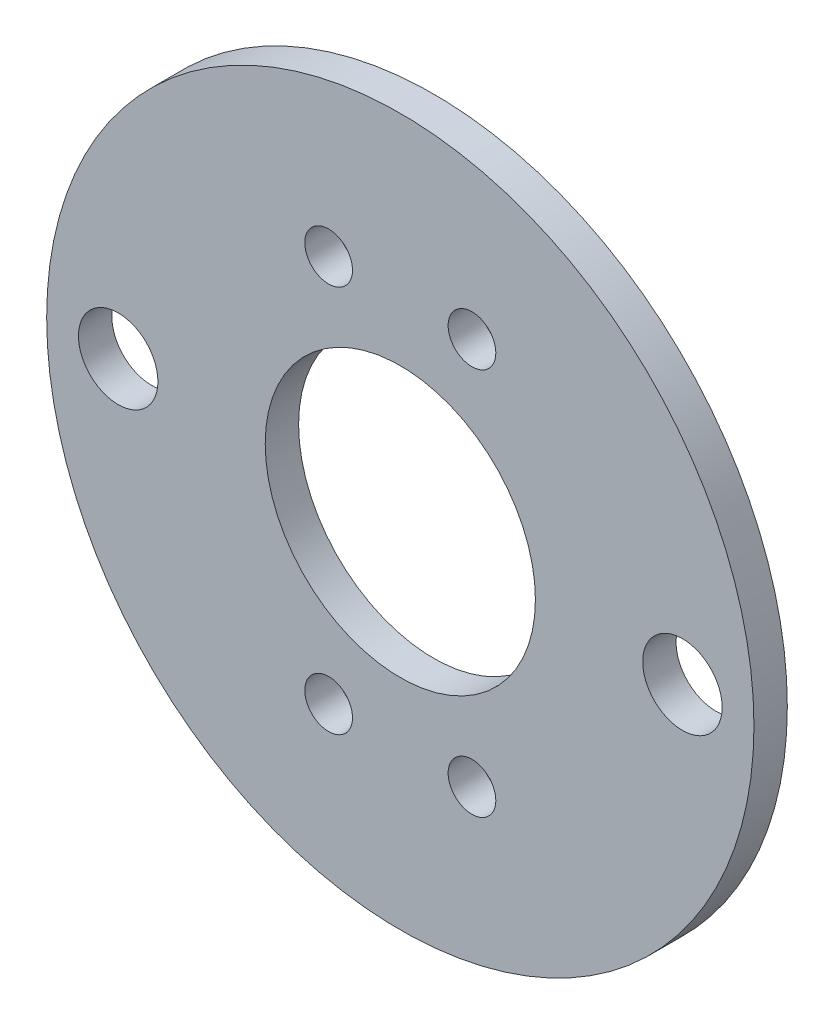
ISO-10303-21;
HEADER;
FILE_DESCRIPTION(('STEP AP214'),'2;1');
FILE_NAME('part.step','',(''),(''),'','','');
FILE_SCHEMA(('AUTOMOTIVE_DESIGN { 1 0 10303 214 1 1 1 1 }'));
ENDSEC;
DATA;
#1=APPLICATION_CONTEXT('core data for automotive mechanical design processes');
#2=APPLICATION_PROTOCOL_DEFINITION('international standard','automotive_design',2000,#1);
#3=PRODUCT_CONTEXT('',#1,'mechanical');
#4=PRODUCT('Part','Part','',(#3));
#5=PRODUCT_RELATED_PRODUCT_CATEGORY('part','',(#4));
#6=PRODUCT_DEFINITION_FORMATION('','',#4);
#7=PRODUCT_DEFINITION_CONTEXT('part definition',#1,'design');
#8=PRODUCT_DEFINITION('design','',#6,#7);
#9=PRODUCT_DEFINITION_SHAPE('','',#8);
#10=(LENGTH_UNIT() NAMED_UNIT(*) SI_UNIT(.MILLI.,.METRE.));
#11=(NAMED_UNIT(*) PLANE_ANGLE_UNIT() SI_UNIT($,.RADIAN.));
#12=(NAMED_UNIT(*) SI_UNIT($,.STERADIAN.) SOLID_ANGLE_UNIT());
#13=UNCERTAINTY_MEASURE_WITH_UNIT(LENGTH_MEASURE(1.E-05),#10,'distance_accuracy_value','');
#14=(GEOMETRIC_REPRESENTATION_CONTEXT(3) GLOBAL_UNCERTAINTY_ASSIGNED_CONTEXT((#13)) GLOBAL_UNIT_ASSIGNED_CONTEXT((#10,
#11,#12)) REPRESENTATION_CONTEXT('',''));
#15=CARTESIAN_POINT('',(0.,0.,0.));
#16=DIRECTION('',(0.,0.,1.));
#17=DIRECTION('',(1.,0.,0.));
#18=AXIS2_PLACEMENT_3D('',#15,#16,#17);
#19=CARTESIAN_POINT('',(1.09092304692803E-13,0.,2.1));
#20=DIRECTION('',(0.,0.,-1.));
#21=DIRECTION('',(-1.,0.,0.));
#22=AXIS2_PLACEMENT_3D('',#19,#20,#21);
#23=CYLINDRICAL_SURFACE('',#22,8.50000000000012);
#24=CARTESIAN_POINT('',(1.09092304692803E-13,0.,2.1));
#25=DIRECTION('',(0.,0.,1.));
#26=DIRECTION('',(1.,0.,0.));
#27=AXIS2_PLACEMENT_3D('',#24,#25,#26);
#28=CIRCLE('',#27,8.50000000000012);
#29=CARTESIAN_POINT('',(8.50000000000023,0.,2.1));
#30=VERTEX_POINT('',#29);
#31=EDGE_CURVE('E44',#30,#30,#28,.T.);
#32=ORIENTED_EDGE('',*,*,#31,.T.);
#33=EDGE_LOOP('',(#32));
#34=FACE_BOUND('',#33,.T.);
#35=CARTESIAN_POINT('',(1.09092304692803E-13,0.,0.));
#36=DIRECTION('',(0.,0.,1.));
#37=DIRECTION('',(1.,0.,0.));
#38=AXIS2_PLACEMENT_3D('',#35,#36,#37);
#39=CIRCLE('',#38,8.50000000000012);
#40=CARTESIAN_POINT('',(8.50000000000023,0.,0.));
#41=VERTEX_POINT('',#40);
#42=EDGE_CURVE('E59',#41,#41,#39,.T.);
#43=ORIENTED_EDGE('',*,*,#42,.F.);
#44=EDGE_LOOP('',(#43));
#45=FACE_BOUND('',#44,.T.);
#46=ADVANCED_FACE('F36',(#34,#45),#23,.F.);
#47=CARTESIAN_POINT('',(17.7499999999999,0.,2.1));
#48=DIRECTION('',(0.,0.,-1.));
#49=DIRECTION('',(-1.,0.,0.));
#50=AXIS2_PLACEMENT_3D('',#47,#48,#49);
#51=CYLINDRICAL_SURFACE('',#50,2.5);
#52=CARTESIAN_POINT('',(17.7499999999999,0.,2.1));
#53=DIRECTION('',(0.,0.,1.));
#54=DIRECTION('',(1.,0.,0.));
#55=AXIS2_PLACEMENT_3D('',#52,#53,#54);
#56=CIRCLE('',#55,2.5);
#57=CARTESIAN_POINT('',(20.2499999999999,0.,2.1));
#58=VERTEX_POINT('',#57);
#59=EDGE_CURVE('E49',#58,#58,#56,.T.);
#60=ORIENTED_EDGE('',*,*,#59,.T.);
#61=EDGE_LOOP('',(#60));
#62=FACE_BOUND('',#61,.T.);
#63=CARTESIAN_POINT('',(17.7499999999999,0.,0.));
#64=DIRECTION('',(0.,0.,1.));
#65=DIRECTION('',(1.,0.,0.));
#66=AXIS2_PLACEMENT_3D('',#63,#64,#65);
#67=CIRCLE('',#66,2.5);
#68=CARTESIAN_POINT('',(20.2499999999999,0.,0.));
#69=VERTEX_POINT('',#68);
#70=EDGE_CURVE('E56',#69,#69,#67,.T.);
#71=ORIENTED_EDGE('',*,*,#70,.F.);
#72=EDGE_LOOP('',(#71));
#73=FACE_BOUND('',#72,.T.);
#74=ADVANCED_FACE('F95',(#62,#73),#51,.F.);
#75=CARTESIAN_POINT('',(-17.7499999999997,0.,2.1));
#76=DIRECTION('',(0.,0.,-1.));
#77=DIRECTION('',(-1.,0.,0.));
#78=AXIS2_PLACEMENT_3D('',#75,#76,#77);
#79=CYLINDRICAL_SURFACE('',#78,2.5);
#80=CARTESIAN_POINT('',(-17.7499999999997,0.,2.1));
#81=DIRECTION('',(0.,0.,1.));
#82=DIRECTION('',(1.,0.,0.));
#83=AXIS2_PLACEMENT_3D('',#80,#81,#82);
#84=CIRCLE('',#83,2.5);
#85=CARTESIAN_POINT('',(-15.2499999999997,0.,2.1));
#86=VERTEX_POINT('',#85);
#87=EDGE_CURVE('E65',#86,#86,#84,.T.);
#88=ORIENTED_EDGE('',*,*,#87,.T.);
#89=EDGE_LOOP('',(#88));
#90=FACE_BOUND('',#89,.T.);
#91=CARTESIAN_POINT('',(-17.7499999999997,0.,0.));
#92=DIRECTION('',(0.,0.,1.));
#93=DIRECTION('',(1.,0.,0.));
#94=AXIS2_PLACEMENT_3D('',#91,#92,#93);
#95=CIRCLE('',#94,2.5);
#96=CARTESIAN_POINT('',(-15.2499999999997,0.,0.));
#97=VERTEX_POINT('',#96);
#98=EDGE_CURVE('E53',#97,#97,#95,.T.);
#99=ORIENTED_EDGE('',*,*,#98,.F.);
#100=EDGE_LOOP('',(#99));
#101=FACE_BOUND('',#100,.T.);
#102=ADVANCED_FACE('F38',(#90,#101),#79,.F.);
#103=CARTESIAN_POINT('',(1.09092304692803E-13,0.,2.1));
#104=DIRECTION('',(0.,0.,-1.));
#105=DIRECTION('',(-1.,0.,0.));
#106=AXIS2_PLACEMENT_3D('',#103,#104,#105);
#107=CYLINDRICAL_SURFACE('',#106,22.2499999999998);
#108=CARTESIAN_POINT('',(1.09092304692803E-13,0.,2.1));
#109=DIRECTION('',(0.,0.,1.));
#110=DIRECTION('',(1.,0.,0.));
#111=AXIS2_PLACEMENT_3D('',#108,#109,#110);
#112=CIRCLE('',#111,22.2499999999998);
#113=CARTESIAN_POINT('',(22.2499999999999,0.,2.1));
#114=VERTEX_POINT('',#113);
#115=EDGE_CURVE('E10',#114,#114,#112,.T.);
#116=ORIENTED_EDGE('',*,*,#115,.F.);
#117=EDGE_LOOP('',(#116));
#118=FACE_BOUND('',#117,.T.);
#119=CARTESIAN_POINT('',(1.09092304692803E-13,0.,0.));
#120=DIRECTION('',(0.,0.,1.));
#121=DIRECTION('',(1.,0.,0.));
#122=AXIS2_PLACEMENT_3D('',#119,#120,#121);
#123=CIRCLE('',#122,22.2499999999998);
#124=CARTESIAN_POINT('',(22.2499999999999,0.,0.));
#125=VERTEX_POINT('',#124);
#126=EDGE_CURVE('E62',#125,#125,#123,.T.);
#127=ORIENTED_EDGE('',*,*,#126,.T.);
#128=EDGE_LOOP('',(#127));
#129=FACE_BOUND('',#128,.T.);
#130=ADVANCED_FACE('F104',(#118,#129),#107,.T.);
#131=CARTESIAN_POINT('',(0.,0.,2.1));
#132=DIRECTION('',(0.,0.,1.));
#133=DIRECTION('',(1.,0.,0.));
#134=AXIS2_PLACEMENT_3D('',#131,#132,#133);
#135=PLANE('',#134);
#136=CARTESIAN_POINT('',(4.50880281690134,12.1930593846788,2.1));
#137=DIRECTION('',(0.,0.,1.));
#138=DIRECTION('',(-1.,0.,0.));
#139=AXIS2_PLACEMENT_3D('',#136,#137,#138);
#140=CIRCLE('',#139,1.5);
#141=CARTESIAN_POINT('',(6.00880281690134,12.1930593846788,2.1));
#142=VERTEX_POINT('',#141);
#143=EDGE_CURVE('E148',#142,#142,#140,.T.);
#144=ORIENTED_EDGE('',*,*,#143,.F.);
#145=EDGE_LOOP('',(#144));
#146=FACE_BOUND('',#145,.T.);
#147=CARTESIAN_POINT('',(-4.50880281690134,-12.1930593846788,2.1));
#148=DIRECTION('',(0.,0.,1.));
#149=DIRECTION('',(-1.,0.,0.));
#150=AXIS2_PLACEMENT_3D('',#147,#148,#149);
#151=CIRCLE('',#150,1.5);
#152=CARTESIAN_POINT('',(-3.00880281690134,-12.1930593846788,2.1));
#153=VERTEX_POINT('',#152);
#154=EDGE_CURVE('E149',#153,#153,#151,.T.);
#155=ORIENTED_EDGE('',*,*,#154,.F.);
#156=EDGE_LOOP('',(#155));
#157=FACE_BOUND('',#156,.T.);
#158=CARTESIAN_POINT('',(-4.50880281690134,12.1930593846788,2.1));
#159=DIRECTION('',(0.,0.,1.));
#160=DIRECTION('',(1.,0.,0.));
#161=AXIS2_PLACEMENT_3D('',#158,#159,#160);
#162=CIRCLE('',#161,1.5);
#163=CARTESIAN_POINT('',(-3.00880281690134,12.1930593846788,2.1));
#164=VERTEX_POINT('',#163);
#165=EDGE_CURVE('E152',#164,#164,#162,.T.);
#166=ORIENTED_EDGE('',*,*,#165,.F.);
#167=EDGE_LOOP('',(#166));
#168=FACE_BOUND('',#167,.T.);
#169=CARTESIAN_POINT('',(4.50880281690134,-12.1930593846788,2.1));
#170=DIRECTION('',(0.,0.,1.));
#171=DIRECTION('',(1.,0.,0.));
#172=AXIS2_PLACEMENT_3D('',#169,#170,#171);
#173=CIRCLE('',#172,1.5);
#174=CARTESIAN_POINT('',(6.00880281690134,-12.1930593846788,2.1));
#175=VERTEX_POINT('',#174);
#176=EDGE_CURVE('E70',#175,#175,#173,.T.);
#177=ORIENTED_EDGE('',*,*,#176,.F.);
#178=EDGE_LOOP('',(#177));
#179=FACE_BOUND('',#178,.T.);
#180=ORIENTED_EDGE('',*,*,#87,.F.);
#181=EDGE_LOOP('',(#180));
#182=FACE_BOUND('',#181,.T.);
#183=ORIENTED_EDGE('',*,*,#59,.F.);
#184=EDGE_LOOP('',(#183));
#185=FACE_BOUND('',#184,.T.);
#186=ORIENTED_EDGE('',*,*,#31,.F.);
#187=EDGE_LOOP('',(#186));
#188=FACE_BOUND('',#187,.T.);
#189=ORIENTED_EDGE('',*,*,#115,.T.);
#190=EDGE_LOOP('',(#189));
#191=FACE_BOUND('',#190,.T.);
#192=ADVANCED_FACE('F107',(#146,#157,#168,#179,#182,#185,#188,#191),#135,.T.);
#193=CARTESIAN_POINT('',(0.,0.,0.));
#194=DIRECTION('',(0.,0.,1.));
#195=DIRECTION('',(1.,0.,0.));
#196=AXIS2_PLACEMENT_3D('',#193,#194,#195);
#197=PLANE('',#196);
#198=CARTESIAN_POINT('',(4.50880281690134,12.1930593846788,0.));
#199=DIRECTION('',(0.,0.,1.));
#200=DIRECTION('',(1.,0.,0.));
#201=AXIS2_PLACEMENT_3D('',#198,#199,#200);
#202=CIRCLE('',#201,1.5);
#203=CARTESIAN_POINT('',(6.00880281690134,12.1930593846788,0.));
#204=VERTEX_POINT('',#203);
#205=EDGE_CURVE('E40',#204,#204,#202,.T.);
#206=ORIENTED_EDGE('',*,*,#205,.T.);
#207=EDGE_LOOP('',(#206));
#208=FACE_BOUND('',#207,.T.);
#209=CARTESIAN_POINT('',(-4.50880281690134,-12.1930593846788,0.));
#210=DIRECTION('',(0.,0.,1.));
#211=DIRECTION('',(1.,0.,0.));
#212=AXIS2_PLACEMENT_3D('',#209,#210,#211);
#213=CIRCLE('',#212,1.5);
#214=CARTESIAN_POINT('',(-3.00880281690134,-12.1930593846788,0.));
#215=VERTEX_POINT('',#214);
#216=EDGE_CURVE('E72',#215,#215,#213,.T.);
#217=ORIENTED_EDGE('',*,*,#216,.T.);
#218=EDGE_LOOP('',(#217));
#219=FACE_BOUND('',#218,.T.);
#220=CARTESIAN_POINT('',(-4.50880281690134,12.1930593846788,0.));
#221=DIRECTION('',(0.,0.,1.));
#222=DIRECTION('',(1.,0.,0.));
#223=AXIS2_PLACEMENT_3D('',#220,#221,#222);
#224=CIRCLE('',#223,1.5);
#225=CARTESIAN_POINT('',(-3.00880281690134,12.1930593846788,0.));
#226=VERTEX_POINT('',#225);
#227=EDGE_CURVE('E69',#226,#226,#224,.T.);
#228=ORIENTED_EDGE('',*,*,#227,.T.);
#229=EDGE_LOOP('',(#228));
#230=FACE_BOUND('',#229,.T.);
#231=CARTESIAN_POINT('',(4.50880281690134,-12.1930593846788,0.));
#232=DIRECTION('',(0.,0.,1.));
#233=DIRECTION('',(1.,0.,0.));
#234=AXIS2_PLACEMENT_3D('',#231,#232,#233);
#235=CIRCLE('',#234,1.5);
#236=CARTESIAN_POINT('',(6.00880281690134,-12.1930593846788,0.));
#237=VERTEX_POINT('',#236);
#238=EDGE_CURVE('E66',#237,#237,#235,.T.);
#239=ORIENTED_EDGE('',*,*,#238,.T.);
#240=EDGE_LOOP('',(#239));
#241=FACE_BOUND('',#240,.T.);
#242=ORIENTED_EDGE('',*,*,#98,.T.);
#243=EDGE_LOOP('',(#242));
#244=FACE_BOUND('',#243,.T.);
#245=ORIENTED_EDGE('',*,*,#70,.T.);
#246=EDGE_LOOP('',(#245));
#247=FACE_BOUND('',#246,.T.);
#248=ORIENTED_EDGE('',*,*,#42,.T.);
#249=EDGE_LOOP('',(#248));
#250=FACE_BOUND('',#249,.T.);
#251=ORIENTED_EDGE('',*,*,#126,.F.);
#252=EDGE_LOOP('',(#251));
#253=FACE_BOUND('',#252,.T.);
#254=ADVANCED_FACE('F79',(#208,#219,#230,#241,#244,#247,#250,#253),#197,.F.);
#255=CARTESIAN_POINT('',(4.50880281690134,-12.1930593846788,-1.2E-05));
#256=DIRECTION('',(0.,0.,1.));
#257=DIRECTION('',(1.,0.,0.));
#258=AXIS2_PLACEMENT_3D('',#255,#256,#257);
#259=CYLINDRICAL_SURFACE('',#258,1.5);
#260=CARTESIAN_POINT('',(6.00880281690134,-12.1930593846788,2.1));
#261=CARTESIAN_POINT('',(6.00880281690134,-12.1930593846788,2.078125));
#262=CARTESIAN_POINT('',(6.00880281690134,-12.1930593846788,2.05625));
#263=CARTESIAN_POINT('',(6.00880281690134,-12.1930593846788,2.0125));
#264=CARTESIAN_POINT('',(6.00880281690134,-12.1930593846788,1.990625));
#265=CARTESIAN_POINT('',(6.00880281690134,-12.1930593846788,1.946875));
#266=CARTESIAN_POINT('',(6.00880281690134,-12.1930593846788,1.925));
#267=CARTESIAN_POINT('',(6.00880281690134,-12.1930593846788,1.88125));
#268=CARTESIAN_POINT('',(6.00880281690134,-12.1930593846788,1.859375));
#269=CARTESIAN_POINT('',(6.00880281690134,-12.1930593846788,1.815625));
#270=CARTESIAN_POINT('',(6.00880281690134,-12.1930593846788,1.79375));
#271=CARTESIAN_POINT('',(6.00880281690134,-12.1930593846788,1.75));
#272=CARTESIAN_POINT('',(6.00880281690134,-12.1930593846788,1.728125));
#273=CARTESIAN_POINT('',(6.00880281690134,-12.1930593846788,1.684375));
#274=CARTESIAN_POINT('',(6.00880281690134,-12.1930593846788,1.6625));
#275=CARTESIAN_POINT('',(6.00880281690134,-12.1930593846788,1.61875));
#276=CARTESIAN_POINT('',(6.00880281690134,-12.1930593846788,1.596875));
#277=CARTESIAN_POINT('',(6.00880281690134,-12.1930593846788,1.553125));
#278=CARTESIAN_POINT('',(6.00880281690134,-12.1930593846788,1.53125));
#279=CARTESIAN_POINT('',(6.00880281690134,-12.1930593846788,1.4875));
#280=CARTESIAN_POINT('',(6.00880281690134,-12.1930593846788,1.465625));
#281=CARTESIAN_POINT('',(6.00880281690134,-12.1930593846788,1.421875));
#282=CARTESIAN_POINT('',(6.00880281690134,-12.1930593846788,1.4));
#283=CARTESIAN_POINT('',(6.00880281690134,-12.1930593846788,1.35625));
#284=CARTESIAN_POINT('',(6.00880281690134,-12.1930593846788,1.334375));
#285=CARTESIAN_POINT('',(6.00880281690134,-12.1930593846788,1.290625));
#286=CARTESIAN_POINT('',(6.00880281690134,-12.1930593846788,1.26875));
#287=CARTESIAN_POINT('',(6.00880281690134,-12.1930593846788,1.225));
#288=CARTESIAN_POINT('',(6.00880281690134,-12.1930593846788,1.203125));
#289=CARTESIAN_POINT('',(6.00880281690134,-12.1930593846788,1.159375));
#290=CARTESIAN_POINT('',(6.00880281690134,-12.1930593846788,1.1375));
#291=CARTESIAN_POINT('',(6.00880281690134,-12.1930593846788,1.09375));
#292=CARTESIAN_POINT('',(6.00880281690134,-12.1930593846788,1.071875));
#293=CARTESIAN_POINT('',(6.00880281690134,-12.1930593846788,1.028125));
#294=CARTESIAN_POINT('',(6.00880281690134,-12.1930593846788,1.00625));
#295=CARTESIAN_POINT('',(6.00880281690134,-12.1930593846788,0.9625));
#296=CARTESIAN_POINT('',(6.00880281690134,-12.1930593846788,0.940625));
#297=CARTESIAN_POINT('',(6.00880281690134,-12.1930593846788,0.896875));
#298=CARTESIAN_POINT('',(6.00880281690134,-12.1930593846788,0.875));
#299=CARTESIAN_POINT('',(6.00880281690134,-12.1930593846788,0.83125));
#300=CARTESIAN_POINT('',(6.00880281690134,-12.1930593846788,0.809375));
#301=CARTESIAN_POINT('',(6.00880281690134,-12.1930593846788,0.765625));
#302=CARTESIAN_POINT('',(6.00880281690134,-12.1930593846788,0.74375));
#303=CARTESIAN_POINT('',(6.00880281690134,-12.1930593846788,0.7));
#304=CARTESIAN_POINT('',(6.00880281690134,-12.1930593846788,0.678125));
#305=CARTESIAN_POINT('',(6.00880281690134,-12.1930593846788,0.634375));
#306=CARTESIAN_POINT('',(6.00880281690134,-12.1930593846788,0.6125));
#307=CARTESIAN_POINT('',(6.00880281690134,-12.1930593846788,0.56875));
#308=CARTESIAN_POINT('',(6.00880281690134,-12.1930593846788,0.546875));
#309=CARTESIAN_POINT('',(6.00880281690134,-12.1930593846788,0.503125));
#310=CARTESIAN_POINT('',(6.00880281690134,-12.1930593846788,0.48125));
#311=CARTESIAN_POINT('',(6.00880281690134,-12.1930593846788,0.4375));
#312=CARTESIAN_POINT('',(6.00880281690134,-12.1930593846788,0.415625));
#313=CARTESIAN_POINT('',(6.00880281690134,-12.1930593846788,0.371875));
#314=CARTESIAN_POINT('',(6.00880281690134,-12.1930593846788,0.35));
#315=CARTESIAN_POINT('',(6.00880281690134,-12.1930593846788,0.30625));
#316=CARTESIAN_POINT('',(6.00880281690134,-12.1930593846788,0.284375));
#317=CARTESIAN_POINT('',(6.00880281690134,-12.1930593846788,0.240625));
#318=CARTESIAN_POINT('',(6.00880281690134,-12.1930593846788,0.21875));
#319=CARTESIAN_POINT('',(6.00880281690134,-12.1930593846788,0.175));
#320=CARTESIAN_POINT('',(6.00880281690134,-12.1930593846788,0.153125));
#321=CARTESIAN_POINT('',(6.00880281690134,-12.1930593846788,0.109375));
#322=CARTESIAN_POINT('',(6.00880281690134,-12.1930593846788,0.0875000000000002));
#323=CARTESIAN_POINT('',(6.00880281690134,-12.1930593846788,0.0437500000000003));
#324=CARTESIAN_POINT('',(6.00880281690134,-12.1930593846788,0.0218750000000003));
#325=CARTESIAN_POINT('',(6.00880281690134,-12.1930593846788,0.));
#326=B_SPLINE_CURVE_WITH_KNOTS('',3,(#260,#261,#262,#263,#264,#265,#266,#267,#268,#269,#270,
#271,#272,#273,#274,#275,#276,#277,#278,#279,#280,#281,#282,#283,#284,#285,#286,#287,#288,#289,
#290,#291,#292,#293,#294,#295,#296,#297,#298,#299,#300,#301,#302,#303,#304,#305,#306,#307,#308,
#309,#310,#311,#312,#313,#314,#315,#316,#317,#318,#319,#320,#321,#322,#323,#324,#325),
.UNSPECIFIED.,.F.,.F.,(4,2,2,2,2,2,2,2,2,2,2,2,2,2,2,2,2,2,2,2,2,2,2,2,2,2,2,2,2,2,2,2,4),(0.,
0.0656250000000001,0.13125,0.196875,0.2625,0.328125,0.39375,0.459375,0.525,0.590625,0.65625,
0.721875,0.7875,0.853125,0.91875,0.984375,1.05,1.115625,1.18125,1.246875,1.3125,1.378125,
1.44375,1.509375,1.575,1.640625,1.70625,1.771875,1.8375,1.903125,1.96875,2.034375,2.1),.UNSPECIFIED.);
#327=EDGE_CURVE('BSEAM111',#175,#237,#326,.T.);
#328=ORIENTED_EDGE('',*,*,#176,.T.);
#329=ORIENTED_EDGE('',*,*,#238,.F.);
#330=ORIENTED_EDGE('',*,*,#327,.T.);
#331=ORIENTED_EDGE('',*,*,#327,.F.);
#332=EDGE_LOOP('',(#328,#330,#329,#331));
#333=FACE_BOUND('',#332,.T.);
#334=ADVANCED_FACE('F111',(#333),#259,.F.);
#335=CARTESIAN_POINT('',(-4.50880281690134,12.1930593846788,-1.2E-05));
#336=DIRECTION('',(0.,0.,1.));
#337=DIRECTION('',(1.,0.,0.));
#338=AXIS2_PLACEMENT_3D('',#335,#336,#337);
#339=CYLINDRICAL_SURFACE('',#338,1.5);
#340=CARTESIAN_POINT('',(-3.00880281690134,12.1930593846788,2.1));
#341=CARTESIAN_POINT('',(-3.00880281690134,12.1930593846788,2.078125));
#342=CARTESIAN_POINT('',(-3.00880281690134,12.1930593846788,2.05625));
#343=CARTESIAN_POINT('',(-3.00880281690134,12.1930593846788,2.0125));
#344=CARTESIAN_POINT('',(-3.00880281690134,12.1930593846788,1.990625));
#345=CARTESIAN_POINT('',(-3.00880281690134,12.1930593846788,1.946875));
#346=CARTESIAN_POINT('',(-3.00880281690134,12.1930593846788,1.925));
#347=CARTESIAN_POINT('',(-3.00880281690134,12.1930593846788,1.88125));
#348=CARTESIAN_POINT('',(-3.00880281690134,12.1930593846788,1.859375));
#349=CARTESIAN_POINT('',(-3.00880281690134,12.1930593846788,1.815625));
#350=CARTESIAN_POINT('',(-3.00880281690134,12.1930593846788,1.79375));
#351=CARTESIAN_POINT('',(-3.00880281690134,12.1930593846788,1.75));
#352=CARTESIAN_POINT('',(-3.00880281690134,12.1930593846788,1.728125));
#353=CARTESIAN_POINT('',(-3.00880281690134,12.1930593846788,1.684375));
#354=CARTESIAN_POINT('',(-3.00880281690134,12.1930593846788,1.6625));
#355=CARTESIAN_POINT('',(-3.00880281690134,12.1930593846788,1.61875));
#356=CARTESIAN_POINT('',(-3.00880281690134,12.1930593846788,1.596875));
#357=CARTESIAN_POINT('',(-3.00880281690134,12.1930593846788,1.553125));
#358=CARTESIAN_POINT('',(-3.00880281690134,12.1930593846788,1.53125));
#359=CARTESIAN_POINT('',(-3.00880281690134,12.1930593846788,1.4875));
#360=CARTESIAN_POINT('',(-3.00880281690134,12.1930593846788,1.465625));
#361=CARTESIAN_POINT('',(-3.00880281690134,12.1930593846788,1.421875));
#362=CARTESIAN_POINT('',(-3.00880281690134,12.1930593846788,1.4));
#363=CARTESIAN_POINT('',(-3.00880281690134,12.1930593846788,1.35625));
#364=CARTESIAN_POINT('',(-3.00880281690134,12.1930593846788,1.334375));
#365=CARTESIAN_POINT('',(-3.00880281690134,12.1930593846788,1.290625));
#366=CARTESIAN_POINT('',(-3.00880281690134,12.1930593846788,1.26875));
#367=CARTESIAN_POINT('',(-3.00880281690134,12.1930593846788,1.225));
#368=CARTESIAN_POINT('',(-3.00880281690134,12.1930593846788,1.203125));
#369=CARTESIAN_POINT('',(-3.00880281690134,12.1930593846788,1.159375));
#370=CARTESIAN_POINT('',(-3.00880281690134,12.1930593846788,1.1375));
#371=CARTESIAN_POINT('',(-3.00880281690134,12.1930593846788,1.09375));
#372=CARTESIAN_POINT('',(-3.00880281690134,12.1930593846788,1.071875));
#373=CARTESIAN_POINT('',(-3.00880281690134,12.1930593846788,1.028125));
#374=CARTESIAN_POINT('',(-3.00880281690134,12.1930593846788,1.00625));
#375=CARTESIAN_POINT('',(-3.00880281690134,12.1930593846788,0.9625));
#376=CARTESIAN_POINT('',(-3.00880281690134,12.1930593846788,0.940625));
#377=CARTESIAN_POINT('',(-3.00880281690134,12.1930593846788,0.896875));
#378=CARTESIAN_POINT('',(-3.00880281690134,12.1930593846788,0.875));
#379=CARTESIAN_POINT('',(-3.00880281690134,12.1930593846788,0.83125));
#380=CARTESIAN_POINT('',(-3.00880281690134,12.1930593846788,0.809375));
#381=CARTESIAN_POINT('',(-3.00880281690134,12.1930593846788,0.765625));
#382=CARTESIAN_POINT('',(-3.00880281690134,12.1930593846788,0.74375));
#383=CARTESIAN_POINT('',(-3.00880281690134,12.1930593846788,0.7));
#384=CARTESIAN_POINT('',(-3.00880281690134,12.1930593846788,0.678125));
#385=CARTESIAN_POINT('',(-3.00880281690134,12.1930593846788,0.634375));
#386=CARTESIAN_POINT('',(-3.00880281690134,12.1930593846788,0.6125));
#387=CARTESIAN_POINT('',(-3.00880281690134,12.1930593846788,0.56875));
#388=CARTESIAN_POINT('',(-3.00880281690134,12.1930593846788,0.546875));
#389=CARTESIAN_POINT('',(-3.00880281690134,12.1930593846788,0.503125));
#390=CARTESIAN_POINT('',(-3.00880281690134,12.1930593846788,0.48125));
#391=CARTESIAN_POINT('',(-3.00880281690134,12.1930593846788,0.4375));
#392=CARTESIAN_POINT('',(-3.00880281690134,12.1930593846788,0.415625));
#393=CARTESIAN_POINT('',(-3.00880281690134,12.1930593846788,0.371875));
#394=CARTESIAN_POINT('',(-3.00880281690134,12.1930593846788,0.35));
#395=CARTESIAN_POINT('',(-3.00880281690134,12.1930593846788,0.30625));
#396=CARTESIAN_POINT('',(-3.00880281690134,12.1930593846788,0.284375));
#397=CARTESIAN_POINT('',(-3.00880281690134,12.1930593846788,0.240625));
#398=CARTESIAN_POINT('',(-3.00880281690134,12.1930593846788,0.21875));
#399=CARTESIAN_POINT('',(-3.00880281690134,12.1930593846788,0.175));
#400=CARTESIAN_POINT('',(-3.00880281690134,12.1930593846788,0.153125));
#401=CARTESIAN_POINT('',(-3.00880281690134,12.1930593846788,0.109375));
#402=CARTESIAN_POINT('',(-3.00880281690134,12.1930593846788,0.0875000000000002));
#403=CARTESIAN_POINT('',(-3.00880281690134,12.1930593846788,0.0437500000000003));
#404=CARTESIAN_POINT('',(-3.00880281690134,12.1930593846788,0.0218750000000003));
#405=CARTESIAN_POINT('',(-3.00880281690134,12.1930593846788,0.));
#406=B_SPLINE_CURVE_WITH_KNOTS('',3,(#340,#341,#342,#343,#344,#345,#346,#347,#348,#349,#350,
#351,#352,#353,#354,#355,#356,#357,#358,#359,#360,#361,#362,#363,#364,#365,#366,#367,#368,#369,
#370,#371,#372,#373,#374,#375,#376,#377,#378,#379,#380,#381,#382,#383,#384,#385,#386,#387,#388,
#389,#390,#391,#392,#393,#394,#395,#396,#397,#398,#399,#400,#401,#402,#403,#404,#405),
.UNSPECIFIED.,.F.,.F.,(4,2,2,2,2,2,2,2,2,2,2,2,2,2,2,2,2,2,2,2,2,2,2,2,2,2,2,2,2,2,2,2,4),(0.,
0.0656250000000001,0.13125,0.196875,0.2625,0.328125,0.39375,0.459375,0.525,0.590625,0.65625,
0.721875,0.7875,0.853125,0.91875,0.984375,1.05,1.115625,1.18125,1.246875,1.3125,1.378125,
1.44375,1.509375,1.575,1.640625,1.70625,1.771875,1.8375,1.903125,1.96875,2.034375,2.1),.UNSPECIFIED.);
#407=EDGE_CURVE('BSEAM89',#164,#226,#406,.T.);
#408=ORIENTED_EDGE('',*,*,#165,.T.);
#409=ORIENTED_EDGE('',*,*,#227,.F.);
#410=ORIENTED_EDGE('',*,*,#407,.T.);
#411=ORIENTED_EDGE('',*,*,#407,.F.);
#412=EDGE_LOOP('',(#408,#410,#409,#411));
#413=FACE_BOUND('',#412,.T.);
#414=ADVANCED_FACE('F89',(#413),#339,.F.);
#415=CARTESIAN_POINT('',(-4.50880281690134,-12.1930593846788,-1.2E-05));
#416=DIRECTION('',(0.,0.,1.));
#417=DIRECTION('',(1.,0.,0.));
#418=AXIS2_PLACEMENT_3D('',#415,#416,#417);
#419=CYLINDRICAL_SURFACE('',#418,1.5);
#420=CARTESIAN_POINT('',(-3.00880281690134,-12.1930593846788,2.1));
#421=CARTESIAN_POINT('',(-3.00880281690134,-12.1930593846788,2.078125));
#422=CARTESIAN_POINT('',(-3.00880281690134,-12.1930593846788,2.05625));
#423=CARTESIAN_POINT('',(-3.00880281690134,-12.1930593846788,2.0125));
#424=CARTESIAN_POINT('',(-3.00880281690134,-12.1930593846788,1.990625));
#425=CARTESIAN_POINT('',(-3.00880281690134,-12.1930593846788,1.946875));
#426=CARTESIAN_POINT('',(-3.00880281690134,-12.1930593846788,1.925));
#427=CARTESIAN_POINT('',(-3.00880281690134,-12.1930593846788,1.88125));
#428=CARTESIAN_POINT('',(-3.00880281690134,-12.1930593846788,1.859375));
#429=CARTESIAN_POINT('',(-3.00880281690134,-12.1930593846788,1.815625));
#430=CARTESIAN_POINT('',(-3.00880281690134,-12.1930593846788,1.79375));
#431=CARTESIAN_POINT('',(-3.00880281690134,-12.1930593846788,1.75));
#432=CARTESIAN_POINT('',(-3.00880281690134,-12.1930593846788,1.728125));
#433=CARTESIAN_POINT('',(-3.00880281690134,-12.1930593846788,1.684375));
#434=CARTESIAN_POINT('',(-3.00880281690134,-12.1930593846788,1.6625));
#435=CARTESIAN_POINT('',(-3.00880281690134,-12.1930593846788,1.61875));
#436=CARTESIAN_POINT('',(-3.00880281690134,-12.1930593846788,1.596875));
#437=CARTESIAN_POINT('',(-3.00880281690134,-12.1930593846788,1.553125));
#438=CARTESIAN_POINT('',(-3.00880281690134,-12.1930593846788,1.53125));
#439=CARTESIAN_POINT('',(-3.00880281690134,-12.1930593846788,1.4875));
#440=CARTESIAN_POINT('',(-3.00880281690134,-12.1930593846788,1.465625));
#441=CARTESIAN_POINT('',(-3.00880281690134,-12.1930593846788,1.421875));
#442=CARTESIAN_POINT('',(-3.00880281690134,-12.1930593846788,1.4));
#443=CARTESIAN_POINT('',(-3.00880281690134,-12.1930593846788,1.35625));
#444=CARTESIAN_POINT('',(-3.00880281690134,-12.1930593846788,1.334375));
#445=CARTESIAN_POINT('',(-3.00880281690134,-12.1930593846788,1.290625));
#446=CARTESIAN_POINT('',(-3.00880281690134,-12.1930593846788,1.26875));
#447=CARTESIAN_POINT('',(-3.00880281690134,-12.1930593846788,1.225));
#448=CARTESIAN_POINT('',(-3.00880281690134,-12.1930593846788,1.203125));
#449=CARTESIAN_POINT('',(-3.00880281690134,-12.1930593846788,1.159375));
#450=CARTESIAN_POINT('',(-3.00880281690134,-12.1930593846788,1.1375));
#451=CARTESIAN_POINT('',(-3.00880281690134,-12.1930593846788,1.09375));
#452=CARTESIAN_POINT('',(-3.00880281690134,-12.1930593846788,1.071875));
#453=CARTESIAN_POINT('',(-3.00880281690134,-12.1930593846788,1.028125));
#454=CARTESIAN_POINT('',(-3.00880281690134,-12.1930593846788,1.00625));
#455=CARTESIAN_POINT('',(-3.00880281690134,-12.1930593846788,0.9625));
#456=CARTESIAN_POINT('',(-3.00880281690134,-12.1930593846788,0.940625));
#457=CARTESIAN_POINT('',(-3.00880281690134,-12.1930593846788,0.896875));
#458=CARTESIAN_POINT('',(-3.00880281690134,-12.1930593846788,0.875));
#459=CARTESIAN_POINT('',(-3.00880281690134,-12.1930593846788,0.83125));
#460=CARTESIAN_POINT('',(-3.00880281690134,-12.1930593846788,0.809375));
#461=CARTESIAN_POINT('',(-3.00880281690134,-12.1930593846788,0.765625));
#462=CARTESIAN_POINT('',(-3.00880281690134,-12.1930593846788,0.74375));
#463=CARTESIAN_POINT('',(-3.00880281690134,-12.1930593846788,0.7));
#464=CARTESIAN_POINT('',(-3.00880281690134,-12.1930593846788,0.678125));
#465=CARTESIAN_POINT('',(-3.00880281690134,-12.1930593846788,0.634375));
#466=CARTESIAN_POINT('',(-3.00880281690134,-12.1930593846788,0.6125));
#467=CARTESIAN_POINT('',(-3.00880281690134,-12.1930593846788,0.56875));
#468=CARTESIAN_POINT('',(-3.00880281690134,-12.1930593846788,0.546875));
#469=CARTESIAN_POINT('',(-3.00880281690134,-12.1930593846788,0.503125));
#470=CARTESIAN_POINT('',(-3.00880281690134,-12.1930593846788,0.48125));
#471=CARTESIAN_POINT('',(-3.00880281690134,-12.1930593846788,0.4375));
#472=CARTESIAN_POINT('',(-3.00880281690134,-12.1930593846788,0.415625));
#473=CARTESIAN_POINT('',(-3.00880281690134,-12.1930593846788,0.371875));
#474=CARTESIAN_POINT('',(-3.00880281690134,-12.1930593846788,0.35));
#475=CARTESIAN_POINT('',(-3.00880281690134,-12.1930593846788,0.30625));
#476=CARTESIAN_POINT('',(-3.00880281690134,-12.1930593846788,0.284375));
#477=CARTESIAN_POINT('',(-3.00880281690134,-12.1930593846788,0.240625));
#478=CARTESIAN_POINT('',(-3.00880281690134,-12.1930593846788,0.21875));
#479=CARTESIAN_POINT('',(-3.00880281690134,-12.1930593846788,0.175));
#480=CARTESIAN_POINT('',(-3.00880281690134,-12.1930593846788,0.153125));
#481=CARTESIAN_POINT('',(-3.00880281690134,-12.1930593846788,0.109375));
#482=CARTESIAN_POINT('',(-3.00880281690134,-12.1930593846788,0.0875000000000002));
#483=CARTESIAN_POINT('',(-3.00880281690134,-12.1930593846788,0.0437500000000003));
#484=CARTESIAN_POINT('',(-3.00880281690134,-12.1930593846788,0.0218750000000003));
#485=CARTESIAN_POINT('',(-3.00880281690134,-12.1930593846788,0.));
#486=B_SPLINE_CURVE_WITH_KNOTS('',3,(#420,#421,#422,#423,#424,#425,#426,#427,#428,#429,#430,
#431,#432,#433,#434,#435,#436,#437,#438,#439,#440,#441,#442,#443,#444,#445,#446,#447,#448,#449,
#450,#451,#452,#453,#454,#455,#456,#457,#458,#459,#460,#461,#462,#463,#464,#465,#466,#467,#468,
#469,#470,#471,#472,#473,#474,#475,#476,#477,#478,#479,#480,#481,#482,#483,#484,#485),
.UNSPECIFIED.,.F.,.F.,(4,2,2,2,2,2,2,2,2,2,2,2,2,2,2,2,2,2,2,2,2,2,2,2,2,2,2,2,2,2,2,2,4),(0.,
0.0656250000000001,0.13125,0.196875,0.2625,0.328125,0.39375,0.459375,0.525,0.590625,0.65625,
0.721875,0.7875,0.853125,0.91875,0.984375,1.05,1.115625,1.18125,1.246875,1.3125,1.378125,
1.44375,1.509375,1.575,1.640625,1.70625,1.771875,1.8375,1.903125,1.96875,2.034375,2.1),.UNSPECIFIED.);
#487=EDGE_CURVE('BSEAM83',#153,#215,#486,.T.);
#488=ORIENTED_EDGE('',*,*,#154,.T.);
#489=ORIENTED_EDGE('',*,*,#216,.F.);
#490=ORIENTED_EDGE('',*,*,#487,.T.);
#491=ORIENTED_EDGE('',*,*,#487,.F.);
#492=EDGE_LOOP('',(#488,#490,#489,#491));
#493=FACE_BOUND('',#492,.T.);
#494=ADVANCED_FACE('F83',(#493),#419,.F.);
#495=CARTESIAN_POINT('',(4.50880281690134,12.1930593846788,-1.2E-05));
#496=DIRECTION('',(0.,0.,1.));
#497=DIRECTION('',(1.,0.,0.));
#498=AXIS2_PLACEMENT_3D('',#495,#496,#497);
#499=CYLINDRICAL_SURFACE('',#498,1.5);
#500=CARTESIAN_POINT('',(6.00880281690134,12.1930593846788,2.1));
#501=CARTESIAN_POINT('',(6.00880281690134,12.1930593846788,2.078125));
#502=CARTESIAN_POINT('',(6.00880281690134,12.1930593846788,2.05625));
#503=CARTESIAN_POINT('',(6.00880281690134,12.1930593846788,2.0125));
#504=CARTESIAN_POINT('',(6.00880281690134,12.1930593846788,1.990625));
#505=CARTESIAN_POINT('',(6.00880281690134,12.1930593846788,1.946875));
#506=CARTESIAN_POINT('',(6.00880281690134,12.1930593846788,1.925));
#507=CARTESIAN_POINT('',(6.00880281690134,12.1930593846788,1.88125));
#508=CARTESIAN_POINT('',(6.00880281690134,12.1930593846788,1.859375));
#509=CARTESIAN_POINT('',(6.00880281690134,12.1930593846788,1.815625));
#510=CARTESIAN_POINT('',(6.00880281690134,12.1930593846788,1.79375));
#511=CARTESIAN_POINT('',(6.00880281690134,12.1930593846788,1.75));
#512=CARTESIAN_POINT('',(6.00880281690134,12.1930593846788,1.728125));
#513=CARTESIAN_POINT('',(6.00880281690134,12.1930593846788,1.684375));
#514=CARTESIAN_POINT('',(6.00880281690134,12.1930593846788,1.6625));
#515=CARTESIAN_POINT('',(6.00880281690134,12.1930593846788,1.61875));
#516=CARTESIAN_POINT('',(6.00880281690134,12.1930593846788,1.596875));
#517=CARTESIAN_POINT('',(6.00880281690134,12.1930593846788,1.553125));
#518=CARTESIAN_POINT('',(6.00880281690134,12.1930593846788,1.53125));
#519=CARTESIAN_POINT('',(6.00880281690134,12.1930593846788,1.4875));
#520=CARTESIAN_POINT('',(6.00880281690134,12.1930593846788,1.465625));
#521=CARTESIAN_POINT('',(6.00880281690134,12.1930593846788,1.421875));
#522=CARTESIAN_POINT('',(6.00880281690134,12.1930593846788,1.4));
#523=CARTESIAN_POINT('',(6.00880281690134,12.1930593846788,1.35625));
#524=CARTESIAN_POINT('',(6.00880281690134,12.1930593846788,1.334375));
#525=CARTESIAN_POINT('',(6.00880281690134,12.1930593846788,1.290625));
#526=CARTESIAN_POINT('',(6.00880281690134,12.1930593846788,1.26875));
#527=CARTESIAN_POINT('',(6.00880281690134,12.1930593846788,1.225));
#528=CARTESIAN_POINT('',(6.00880281690134,12.1930593846788,1.203125));
#529=CARTESIAN_POINT('',(6.00880281690134,12.1930593846788,1.159375));
#530=CARTESIAN_POINT('',(6.00880281690134,12.1930593846788,1.1375));
#531=CARTESIAN_POINT('',(6.00880281690134,12.1930593846788,1.09375));
#532=CARTESIAN_POINT('',(6.00880281690134,12.1930593846788,1.071875));
#533=CARTESIAN_POINT('',(6.00880281690134,12.1930593846788,1.028125));
#534=CARTESIAN_POINT('',(6.00880281690134,12.1930593846788,1.00625));
#535=CARTESIAN_POINT('',(6.00880281690134,12.1930593846788,0.9625));
#536=CARTESIAN_POINT('',(6.00880281690134,12.1930593846788,0.940625));
#537=CARTESIAN_POINT('',(6.00880281690134,12.1930593846788,0.896875));
#538=CARTESIAN_POINT('',(6.00880281690134,12.1930593846788,0.875));
#539=CARTESIAN_POINT('',(6.00880281690134,12.1930593846788,0.83125));
#540=CARTESIAN_POINT('',(6.00880281690134,12.1930593846788,0.809375));
#541=CARTESIAN_POINT('',(6.00880281690134,12.1930593846788,0.765625));
#542=CARTESIAN_POINT('',(6.00880281690134,12.1930593846788,0.74375));
#543=CARTESIAN_POINT('',(6.00880281690134,12.1930593846788,0.7));
#544=CARTESIAN_POINT('',(6.00880281690134,12.1930593846788,0.678125));
#545=CARTESIAN_POINT('',(6.00880281690134,12.1930593846788,0.634375));
#546=CARTESIAN_POINT('',(6.00880281690134,12.1930593846788,0.6125));
#547=CARTESIAN_POINT('',(6.00880281690134,12.1930593846788,0.56875));
#548=CARTESIAN_POINT('',(6.00880281690134,12.1930593846788,0.546875));
#549=CARTESIAN_POINT('',(6.00880281690134,12.1930593846788,0.503125));
#550=CARTESIAN_POINT('',(6.00880281690134,12.1930593846788,0.48125));
#551=CARTESIAN_POINT('',(6.00880281690134,12.1930593846788,0.4375));
#552=CARTESIAN_POINT('',(6.00880281690134,12.1930593846788,0.415625));
#553=CARTESIAN_POINT('',(6.00880281690134,12.1930593846788,0.371875));
#554=CARTESIAN_POINT('',(6.00880281690134,12.1930593846788,0.35));
#555=CARTESIAN_POINT('',(6.00880281690134,12.1930593846788,0.30625));
#556=CARTESIAN_POINT('',(6.00880281690134,12.1930593846788,0.284375));
#557=CARTESIAN_POINT('',(6.00880281690134,12.1930593846788,0.240625));
#558=CARTESIAN_POINT('',(6.00880281690134,12.1930593846788,0.21875));
#559=CARTESIAN_POINT('',(6.00880281690134,12.1930593846788,0.175));
#560=CARTESIAN_POINT('',(6.00880281690134,12.1930593846788,0.153125));
#561=CARTESIAN_POINT('',(6.00880281690134,12.1930593846788,0.109375));
#562=CARTESIAN_POINT('',(6.00880281690134,12.1930593846788,0.0875000000000002));
#563=CARTESIAN_POINT('',(6.00880281690134,12.1930593846788,0.0437500000000003));
#564=CARTESIAN_POINT('',(6.00880281690134,12.1930593846788,0.0218750000000003));
#565=CARTESIAN_POINT('',(6.00880281690134,12.1930593846788,0.));
#566=B_SPLINE_CURVE_WITH_KNOTS('',3,(#500,#501,#502,#503,#504,#505,#506,#507,#508,#509,#510,
#511,#512,#513,#514,#515,#516,#517,#518,#519,#520,#521,#522,#523,#524,#525,#526,#527,#528,#529,
#530,#531,#532,#533,#534,#535,#536,#537,#538,#539,#540,#541,#542,#543,#544,#545,#546,#547,#548,
#549,#550,#551,#552,#553,#554,#555,#556,#557,#558,#559,#560,#561,#562,#563,#564,#565),
.UNSPECIFIED.,.F.,.F.,(4,2,2,2,2,2,2,2,2,2,2,2,2,2,2,2,2,2,2,2,2,2,2,2,2,2,2,2,2,2,2,2,4),(0.,
0.0656250000000001,0.13125,0.196875,0.2625,0.328125,0.39375,0.459375,0.525,0.590625,0.65625,
0.721875,0.7875,0.853125,0.91875,0.984375,1.05,1.115625,1.18125,1.246875,1.3125,1.378125,
1.44375,1.509375,1.575,1.640625,1.70625,1.771875,1.8375,1.903125,1.96875,2.034375,2.1),.UNSPECIFIED.);
#567=EDGE_CURVE('BSEAM81',#142,#204,#566,.T.);
#568=ORIENTED_EDGE('',*,*,#143,.T.);
#569=ORIENTED_EDGE('',*,*,#205,.F.);
#570=ORIENTED_EDGE('',*,*,#567,.T.);
#571=ORIENTED_EDGE('',*,*,#567,.F.);
#572=EDGE_LOOP('',(#568,#570,#569,#571));
#573=FACE_BOUND('',#572,.T.);
#574=ADVANCED_FACE('F81',(#573),#499,.F.);
#575=CLOSED_SHELL('',(#46,#74,#102,#130,#192,#254,#334,#414,#494,#574));
#576=MANIFOLD_SOLID_BREP('B2',#575);
#577=ADVANCED_BREP_SHAPE_REPRESENTATION('',(#18,#576),#14);
#578=SHAPE_DEFINITION_REPRESENTATION(#9,#577);
ENDSEC;
END-ISO-10303-21;
